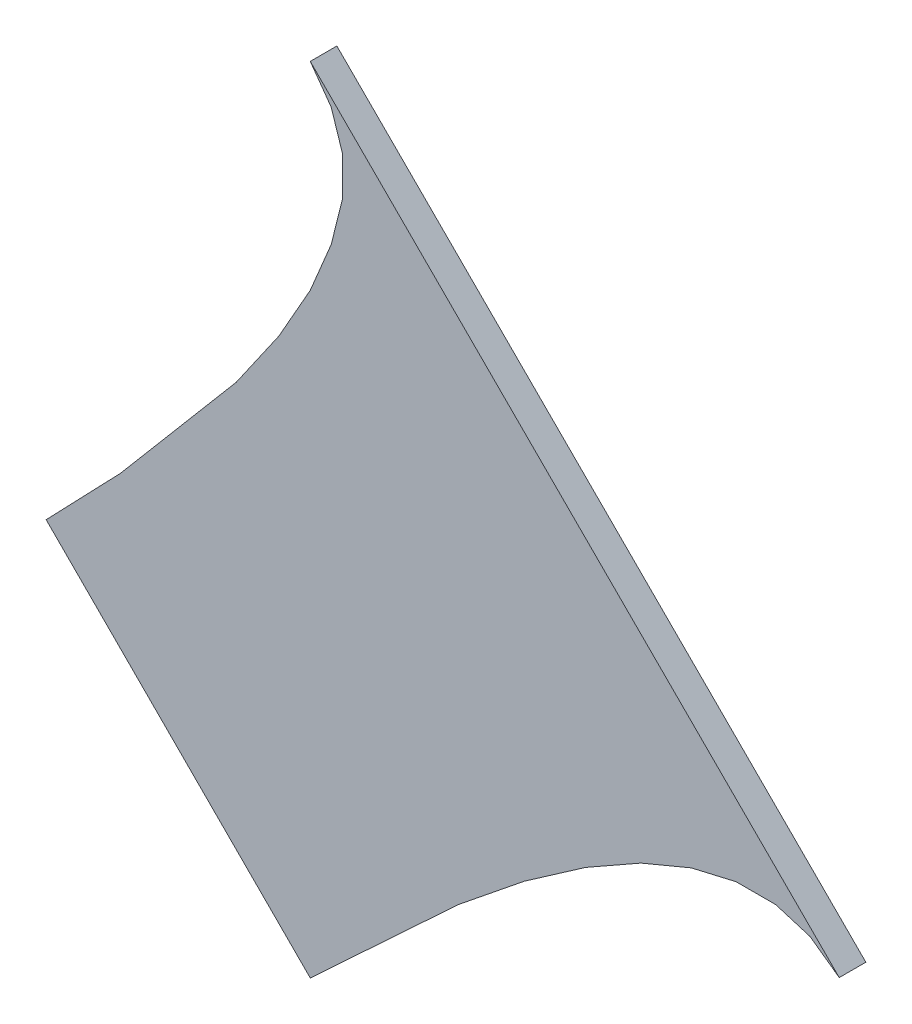
ISO-10303-21;
HEADER;
FILE_DESCRIPTION(('STEP AP214'),'2;1');
FILE_NAME('part.step','',(''),(''),'','','');
FILE_SCHEMA(('AUTOMOTIVE_DESIGN { 1 0 10303 214 1 1 1 1 }'));
ENDSEC;
DATA;
#1=APPLICATION_CONTEXT('core data for automotive mechanical design processes');
#2=APPLICATION_PROTOCOL_DEFINITION('international standard','automotive_design',2000,#1);
#3=PRODUCT_CONTEXT('',#1,'mechanical');
#4=PRODUCT('Part','Part','',(#3));
#5=PRODUCT_RELATED_PRODUCT_CATEGORY('part','',(#4));
#6=PRODUCT_DEFINITION_FORMATION('','',#4);
#7=PRODUCT_DEFINITION_CONTEXT('part definition',#1,'design');
#8=PRODUCT_DEFINITION('design','',#6,#7);
#9=PRODUCT_DEFINITION_SHAPE('','',#8);
#10=(LENGTH_UNIT() NAMED_UNIT(*) SI_UNIT(.MILLI.,.METRE.));
#11=(NAMED_UNIT(*) PLANE_ANGLE_UNIT() SI_UNIT($,.RADIAN.));
#12=(NAMED_UNIT(*) SI_UNIT($,.STERADIAN.) SOLID_ANGLE_UNIT());
#13=UNCERTAINTY_MEASURE_WITH_UNIT(LENGTH_MEASURE(1.E-05),#10,'distance_accuracy_value','');
#14=(GEOMETRIC_REPRESENTATION_CONTEXT(3) GLOBAL_UNCERTAINTY_ASSIGNED_CONTEXT((#13)) GLOBAL_UNIT_ASSIGNED_CONTEXT((#10,
#11,#12)) REPRESENTATION_CONTEXT('',''));
#15=CARTESIAN_POINT('',(0.,0.,0.));
#16=DIRECTION('',(0.,0.,1.));
#17=DIRECTION('',(1.,0.,0.));
#18=AXIS2_PLACEMENT_3D('',#15,#16,#17);
#19=CARTESIAN_POINT('',(108.472999572754,115.299003601074,0.));
#20=DIRECTION('',(-0.680734703798649,0.732530042417487,0.));
#21=DIRECTION('',(0.732530042417487,0.680734703798649,0.));
#22=AXIS2_PLACEMENT_3D('',#19,#20,#21);
#23=PLANE('',#22);
#24=DIRECTION('',(0.732530042417487,0.680734703798649,0.));
#25=VECTOR('',#24,1.);
#26=CARTESIAN_POINT('',(108.472999572754,115.299003601074,0.03556));
#27=LINE('',#26,#25);
#28=CARTESIAN_POINT('',(108.472999572754,115.299003601074,0.03556));
#29=VERTEX_POINT('',#28);
#30=CARTESIAN_POINT('',(108.670997619629,115.483001708984,0.03556));
#31=VERTEX_POINT('',#30);
#32=EDGE_CURVE('E11',#29,#31,#27,.T.);
#33=ORIENTED_EDGE('',*,*,#32,.F.);
#34=DIRECTION('',(0.,0.,1.));
#35=VECTOR('',#34,1.);
#36=CARTESIAN_POINT('',(108.472999572754,115.299003601074,0.));
#37=LINE('',#36,#35);
#38=CARTESIAN_POINT('',(108.472999572754,115.299003601074,0.));
#39=VERTEX_POINT('',#38);
#40=EDGE_CURVE('E24',#39,#29,#37,.T.);
#41=ORIENTED_EDGE('',*,*,#40,.F.);
#42=DIRECTION('',(0.732530042417487,0.680734703798649,0.));
#43=VECTOR('',#42,1.);
#44=CARTESIAN_POINT('',(108.472999572754,115.299003601074,0.));
#45=LINE('',#44,#43);
#46=CARTESIAN_POINT('',(108.670997619629,115.483001708984,0.));
#47=VERTEX_POINT('',#46);
#48=EDGE_CURVE('E172',#39,#47,#45,.T.);
#49=ORIENTED_EDGE('',*,*,#48,.T.);
#50=DIRECTION('',(0.,0.,1.));
#51=VECTOR('',#50,1.);
#52=CARTESIAN_POINT('',(108.670997619629,115.483001708984,0.));
#53=LINE('',#52,#51);
#54=EDGE_CURVE('E37',#47,#31,#53,.T.);
#55=ORIENTED_EDGE('',*,*,#54,.T.);
#56=EDGE_LOOP('',(#33,#41,#49,#55));
#57=FACE_BOUND('',#56,.T.);
#58=ADVANCED_FACE('F17',(#57),#23,.F.);
#59=CARTESIAN_POINT('',(108.670997619629,115.483001708984,0.));
#60=DIRECTION('',(-0.627898828977901,0.778294970154748,0.));
#61=DIRECTION('',(0.778294970154748,0.627898828977901,0.));
#62=AXIS2_PLACEMENT_3D('',#59,#60,#61);
#63=PLANE('',#62);
#64=DIRECTION('',(0.778294970154748,0.627898828977901,0.));
#65=VECTOR('',#64,1.);
#66=CARTESIAN_POINT('',(108.670997619629,115.483001708984,0.03556));
#67=LINE('',#66,#65);
#68=CARTESIAN_POINT('',(108.759002685547,115.554000854492,0.03556));
#69=VERTEX_POINT('',#68);
#70=EDGE_CURVE('E308',#31,#69,#67,.T.);
#71=ORIENTED_EDGE('',*,*,#70,.F.);
#72=ORIENTED_EDGE('',*,*,#54,.F.);
#73=DIRECTION('',(0.778294970154748,0.627898828977901,0.));
#74=VECTOR('',#73,1.);
#75=CARTESIAN_POINT('',(108.670997619629,115.483001708984,0.));
#76=LINE('',#75,#74);
#77=CARTESIAN_POINT('',(108.759002685547,115.554000854492,0.));
#78=VERTEX_POINT('',#77);
#79=EDGE_CURVE('E305',#47,#78,#76,.T.);
#80=ORIENTED_EDGE('',*,*,#79,.T.);
#81=DIRECTION('',(0.,0.,1.));
#82=VECTOR('',#81,1.);
#83=CARTESIAN_POINT('',(108.759002685547,115.554000854492,0.));
#84=LINE('',#83,#82);
#85=EDGE_CURVE('E303',#78,#69,#84,.T.);
#86=ORIENTED_EDGE('',*,*,#85,.T.);
#87=EDGE_LOOP('',(#71,#72,#80,#86));
#88=FACE_BOUND('',#87,.T.);
#89=ADVANCED_FACE('F316',(#88),#63,.F.);
#90=CARTESIAN_POINT('',(108.759002685547,115.554000854492,0.));
#91=DIRECTION('',(-0.570762267595056,0.821115359672287,0.));
#92=DIRECTION('',(0.821115359672287,0.570762267595056,0.));
#93=AXIS2_PLACEMENT_3D('',#90,#91,#92);
#94=PLANE('',#93);
#95=DIRECTION('',(0.821115359672287,0.570762267595056,0.));
#96=VECTOR('',#95,1.);
#97=CARTESIAN_POINT('',(108.759002685547,115.554000854492,0.03556));
#98=LINE('',#97,#96);
#99=CARTESIAN_POINT('',(108.841003417969,115.611000061035,0.03556));
#100=VERTEX_POINT('',#99);
#101=EDGE_CURVE('E300',#69,#100,#98,.T.);
#102=ORIENTED_EDGE('',*,*,#101,.F.);
#103=ORIENTED_EDGE('',*,*,#85,.F.);
#104=DIRECTION('',(0.821115359672287,0.570762267595056,0.));
#105=VECTOR('',#104,1.);
#106=CARTESIAN_POINT('',(108.759002685547,115.554000854492,0.));
#107=LINE('',#106,#105);
#108=CARTESIAN_POINT('',(108.841003417969,115.611000061035,0.));
#109=VERTEX_POINT('',#108);
#110=EDGE_CURVE('E297',#78,#109,#107,.T.);
#111=ORIENTED_EDGE('',*,*,#110,.T.);
#112=DIRECTION('',(0.,0.,1.));
#113=VECTOR('',#112,1.);
#114=CARTESIAN_POINT('',(108.841003417969,115.611000061035,0.));
#115=LINE('',#114,#113);
#116=EDGE_CURVE('E295',#109,#100,#115,.T.);
#117=ORIENTED_EDGE('',*,*,#116,.T.);
#118=EDGE_LOOP('',(#102,#103,#111,#117));
#119=FACE_BOUND('',#118,.T.);
#120=ADVANCED_FACE('F322',(#119),#94,.F.);
#121=CARTESIAN_POINT('',(108.841003417969,115.611000061035,0.));
#122=DIRECTION('',(-0.493616517242774,0.869679673158522,0.));
#123=DIRECTION('',(0.869679673158522,0.493616517242774,0.));
#124=AXIS2_PLACEMENT_3D('',#121,#122,#123);
#125=PLANE('',#124);
#126=DIRECTION('',(0.869679673158522,0.493616517242774,0.));
#127=VECTOR('',#126,1.);
#128=CARTESIAN_POINT('',(108.841003417969,115.611000061035,0.03556));
#129=LINE('',#128,#127);
#130=CARTESIAN_POINT('',(108.915000915527,115.65299987793,0.03556));
#131=VERTEX_POINT('',#130);
#132=EDGE_CURVE('E292',#100,#131,#129,.T.);
#133=ORIENTED_EDGE('',*,*,#132,.F.);
#134=ORIENTED_EDGE('',*,*,#116,.F.);
#135=DIRECTION('',(0.869679673158522,0.493616517242774,0.));
#136=VECTOR('',#135,1.);
#137=CARTESIAN_POINT('',(108.841003417969,115.611000061035,0.));
#138=LINE('',#137,#136);
#139=CARTESIAN_POINT('',(108.915000915527,115.65299987793,0.));
#140=VERTEX_POINT('',#139);
#141=EDGE_CURVE('E289',#109,#140,#138,.T.);
#142=ORIENTED_EDGE('',*,*,#141,.T.);
#143=DIRECTION('',(0.,0.,1.));
#144=VECTOR('',#143,1.);
#145=CARTESIAN_POINT('',(108.915000915527,115.65299987793,0.));
#146=LINE('',#145,#144);
#147=EDGE_CURVE('E287',#140,#131,#146,.T.);
#148=ORIENTED_EDGE('',*,*,#147,.T.);
#149=EDGE_LOOP('',(#133,#134,#142,#148));
#150=FACE_BOUND('',#149,.T.);
#151=ADVANCED_FACE('F324',(#150),#125,.F.);
#152=CARTESIAN_POINT('',(108.915000915527,115.65299987793,0.));
#153=DIRECTION('',(-0.385584994163033,0.922672321182495,0.));
#154=DIRECTION('',(0.922672321182495,0.385584994163033,0.));
#155=AXIS2_PLACEMENT_3D('',#152,#153,#154);
#156=PLANE('',#155);
#157=DIRECTION('',(0.922672321182495,0.385584994163033,0.));
#158=VECTOR('',#157,1.);
#159=CARTESIAN_POINT('',(108.915000915527,115.65299987793,0.03556));
#160=LINE('',#159,#158);
#161=CARTESIAN_POINT('',(108.982002258301,115.680999755859,0.03556));
#162=VERTEX_POINT('',#161);
#163=EDGE_CURVE('E284',#131,#162,#160,.T.);
#164=ORIENTED_EDGE('',*,*,#163,.F.);
#165=ORIENTED_EDGE('',*,*,#147,.F.);
#166=DIRECTION('',(0.922672321182495,0.385584994163033,0.));
#167=VECTOR('',#166,1.);
#168=CARTESIAN_POINT('',(108.915000915527,115.65299987793,0.));
#169=LINE('',#168,#167);
#170=CARTESIAN_POINT('',(108.982002258301,115.680999755859,0.));
#171=VERTEX_POINT('',#170);
#172=EDGE_CURVE('E281',#140,#171,#169,.T.);
#173=ORIENTED_EDGE('',*,*,#172,.T.);
#174=DIRECTION('',(0.,0.,1.));
#175=VECTOR('',#174,1.);
#176=CARTESIAN_POINT('',(108.982002258301,115.680999755859,0.));
#177=LINE('',#176,#175);
#178=EDGE_CURVE('E279',#171,#162,#177,.T.);
#179=ORIENTED_EDGE('',*,*,#178,.T.);
#180=EDGE_LOOP('',(#164,#165,#173,#179));
#181=FACE_BOUND('',#180,.T.);
#182=ADVANCED_FACE('F329',(#181),#156,.F.);
#183=CARTESIAN_POINT('',(108.982002258301,115.680999755859,0.));
#184=DIRECTION('',(-0.227237445006023,0.973839382848699,0.));
#185=DIRECTION('',(0.973839382848699,0.227237445006023,0.));
#186=AXIS2_PLACEMENT_3D('',#183,#184,#185);
#187=PLANE('',#186);
#188=DIRECTION('',(0.973839382848699,0.227237445006023,0.));
#189=VECTOR('',#188,1.);
#190=CARTESIAN_POINT('',(108.982002258301,115.680999755859,0.03556));
#191=LINE('',#190,#189);
#192=CARTESIAN_POINT('',(109.041999816895,115.694999694824,0.03556));
#193=VERTEX_POINT('',#192);
#194=EDGE_CURVE('E276',#162,#193,#191,.T.);
#195=ORIENTED_EDGE('',*,*,#194,.F.);
#196=ORIENTED_EDGE('',*,*,#178,.F.);
#197=DIRECTION('',(0.973839382848699,0.227237445006023,0.));
#198=VECTOR('',#197,1.);
#199=CARTESIAN_POINT('',(108.982002258301,115.680999755859,0.));
#200=LINE('',#199,#198);
#201=CARTESIAN_POINT('',(109.041999816895,115.694999694824,0.));
#202=VERTEX_POINT('',#201);
#203=EDGE_CURVE('E273',#171,#202,#200,.T.);
#204=ORIENTED_EDGE('',*,*,#203,.T.);
#205=DIRECTION('',(0.,0.,1.));
#206=VECTOR('',#205,1.);
#207=CARTESIAN_POINT('',(109.041999816895,115.694999694824,0.));
#208=LINE('',#207,#206);
#209=EDGE_CURVE('E271',#202,#193,#208,.T.);
#210=ORIENTED_EDGE('',*,*,#209,.T.);
#211=EDGE_LOOP('',(#195,#196,#204,#210));
#212=FACE_BOUND('',#211,.T.);
#213=ADVANCED_FACE('F332',(#212),#187,.F.);
#214=CARTESIAN_POINT('',(109.041999816895,115.694999694824,0.));
#215=DIRECTION('',(0.,1.,0.));
#216=DIRECTION('',(1.,0.,0.));
#217=AXIS2_PLACEMENT_3D('',#214,#215,#216);
#218=PLANE('',#217);
#219=DIRECTION('',(1.,0.,0.));
#220=VECTOR('',#219,1.);
#221=CARTESIAN_POINT('',(109.041999816895,115.694999694824,0.03556));
#222=LINE('',#221,#220);
#223=CARTESIAN_POINT('',(109.095001220703,115.694999694824,0.03556));
#224=VERTEX_POINT('',#223);
#225=EDGE_CURVE('E268',#193,#224,#222,.T.);
#226=ORIENTED_EDGE('',*,*,#225,.F.);
#227=ORIENTED_EDGE('',*,*,#209,.F.);
#228=DIRECTION('',(1.,0.,0.));
#229=VECTOR('',#228,1.);
#230=CARTESIAN_POINT('',(109.041999816895,115.694999694824,0.));
#231=LINE('',#230,#229);
#232=CARTESIAN_POINT('',(109.095001220703,115.694999694824,0.));
#233=VERTEX_POINT('',#232);
#234=EDGE_CURVE('E265',#202,#233,#231,.T.);
#235=ORIENTED_EDGE('',*,*,#234,.T.);
#236=DIRECTION('',(0.,0.,1.));
#237=VECTOR('',#236,1.);
#238=CARTESIAN_POINT('',(109.095001220703,115.694999694824,0.));
#239=LINE('',#238,#237);
#240=EDGE_CURVE('E263',#233,#224,#239,.T.);
#241=ORIENTED_EDGE('',*,*,#240,.T.);
#242=EDGE_LOOP('',(#226,#227,#235,#241));
#243=FACE_BOUND('',#242,.T.);
#244=ADVANCED_FACE('F337',(#243),#218,.F.);
#245=CARTESIAN_POINT('',(109.095001220703,115.694999694824,0.));
#246=DIRECTION('',(0.291174244115219,0.956670036932239,0.));
#247=DIRECTION('',(0.956670036932239,-0.291174244115219,0.));
#248=AXIS2_PLACEMENT_3D('',#245,#246,#247);
#249=PLANE('',#248);
#250=DIRECTION('',(0.956670036932239,-0.291174244115219,0.));
#251=VECTOR('',#250,1.);
#252=CARTESIAN_POINT('',(109.095001220703,115.694999694824,0.03556));
#253=LINE('',#252,#251);
#254=CARTESIAN_POINT('',(109.140998840332,115.680999755859,0.03556));
#255=VERTEX_POINT('',#254);
#256=EDGE_CURVE('E260',#224,#255,#253,.T.);
#257=ORIENTED_EDGE('',*,*,#256,.F.);
#258=ORIENTED_EDGE('',*,*,#240,.F.);
#259=DIRECTION('',(0.956670036932239,-0.291174244115219,0.));
#260=VECTOR('',#259,1.);
#261=CARTESIAN_POINT('',(109.095001220703,115.694999694824,0.));
#262=LINE('',#261,#260);
#263=CARTESIAN_POINT('',(109.140998840332,115.680999755859,0.));
#264=VERTEX_POINT('',#263);
#265=EDGE_CURVE('E257',#233,#264,#262,.T.);
#266=ORIENTED_EDGE('',*,*,#265,.T.);
#267=DIRECTION('',(0.,0.,1.));
#268=VECTOR('',#267,1.);
#269=CARTESIAN_POINT('',(109.140998840332,115.680999755859,0.));
#270=LINE('',#269,#268);
#271=EDGE_CURVE('E255',#264,#255,#270,.T.);
#272=ORIENTED_EDGE('',*,*,#271,.T.);
#273=EDGE_LOOP('',(#257,#258,#266,#272));
#274=FACE_BOUND('',#273,.T.);
#275=ADVANCED_FACE('F340',(#274),#249,.F.);
#276=CARTESIAN_POINT('',(109.140998840332,115.680999755859,0.));
#277=DIRECTION('',(0.583190650931696,0.812335315412216,0.));
#278=DIRECTION('',(0.812335315412216,-0.583190650931696,0.));
#279=AXIS2_PLACEMENT_3D('',#276,#277,#278);
#280=PLANE('',#279);
#281=DIRECTION('',(0.812335315412216,-0.583190650931696,0.));
#282=VECTOR('',#281,1.);
#283=CARTESIAN_POINT('',(109.140998840332,115.680999755859,0.03556));
#284=LINE('',#283,#282);
#285=CARTESIAN_POINT('',(109.180000305176,115.65299987793,0.03556));
#286=VERTEX_POINT('',#285);
#287=EDGE_CURVE('E252',#255,#286,#284,.T.);
#288=ORIENTED_EDGE('',*,*,#287,.F.);
#289=ORIENTED_EDGE('',*,*,#271,.F.);
#290=DIRECTION('',(0.812335315412216,-0.583190650931696,0.));
#291=VECTOR('',#290,1.);
#292=CARTESIAN_POINT('',(109.140998840332,115.680999755859,0.));
#293=LINE('',#292,#291);
#294=CARTESIAN_POINT('',(109.180000305176,115.65299987793,0.));
#295=VERTEX_POINT('',#294);
#296=EDGE_CURVE('E249',#264,#295,#293,.T.);
#297=ORIENTED_EDGE('',*,*,#296,.T.);
#298=DIRECTION('',(0.,0.,1.));
#299=VECTOR('',#298,1.);
#300=CARTESIAN_POINT('',(109.180000305176,115.65299987793,0.));
#301=LINE('',#300,#299);
#302=EDGE_CURVE('E247',#295,#286,#301,.T.);
#303=ORIENTED_EDGE('',*,*,#302,.T.);
#304=EDGE_LOOP('',(#288,#289,#297,#303));
#305=FACE_BOUND('',#304,.T.);
#306=ADVANCED_FACE('F345',(#305),#280,.F.);
#307=CARTESIAN_POINT('',(109.180000305176,115.65299987793,0.));
#308=DIRECTION('',(-0.707106781186548,-0.707106781186548,0.));
#309=DIRECTION('',(-0.707106781186548,0.707106781186548,0.));
#310=AXIS2_PLACEMENT_3D('',#307,#308,#309);
#311=PLANE('',#310);
#312=DIRECTION('',(-0.707106781186548,0.707106781186548,0.));
#313=VECTOR('',#312,1.);
#314=CARTESIAN_POINT('',(109.180000305176,115.65299987793,0.03556));
#315=LINE('',#314,#313);
#316=CARTESIAN_POINT('',(108.472999572754,116.360000610352,0.03556));
#317=VERTEX_POINT('',#316);
#318=EDGE_CURVE('E244',#286,#317,#315,.T.);
#319=ORIENTED_EDGE('',*,*,#318,.F.);
#320=ORIENTED_EDGE('',*,*,#302,.F.);
#321=DIRECTION('',(-0.707106781186548,0.707106781186548,0.));
#322=VECTOR('',#321,1.);
#323=CARTESIAN_POINT('',(109.180000305176,115.65299987793,0.));
#324=LINE('',#323,#322);
#325=CARTESIAN_POINT('',(108.472999572754,116.360000610352,0.));
#326=VERTEX_POINT('',#325);
#327=EDGE_CURVE('E241',#295,#326,#324,.T.);
#328=ORIENTED_EDGE('',*,*,#327,.T.);
#329=DIRECTION('',(0.,0.,1.));
#330=VECTOR('',#329,1.);
#331=CARTESIAN_POINT('',(108.472999572754,116.360000610352,0.));
#332=LINE('',#331,#330);
#333=EDGE_CURVE('E239',#326,#317,#332,.T.);
#334=ORIENTED_EDGE('',*,*,#333,.T.);
#335=EDGE_LOOP('',(#319,#320,#328,#334));
#336=FACE_BOUND('',#335,.T.);
#337=ADVANCED_FACE('F348',(#336),#311,.F.);
#338=CARTESIAN_POINT('',(108.472999572754,116.360000610352,0.));
#339=DIRECTION('',(0.812335315412216,0.583190650931696,0.));
#340=DIRECTION('',(0.583190650931696,-0.812335315412216,0.));
#341=AXIS2_PLACEMENT_3D('',#338,#339,#340);
#342=PLANE('',#341);
#343=DIRECTION('',(0.583190650931696,-0.812335315412216,0.));
#344=VECTOR('',#343,1.);
#345=CARTESIAN_POINT('',(108.472999572754,116.360000610352,0.03556));
#346=LINE('',#345,#344);
#347=CARTESIAN_POINT('',(108.500999450684,116.320999145508,0.03556));
#348=VERTEX_POINT('',#347);
#349=EDGE_CURVE('E236',#317,#348,#346,.T.);
#350=ORIENTED_EDGE('',*,*,#349,.F.);
#351=ORIENTED_EDGE('',*,*,#333,.F.);
#352=DIRECTION('',(0.583190650931696,-0.812335315412216,0.));
#353=VECTOR('',#352,1.);
#354=CARTESIAN_POINT('',(108.472999572754,116.360000610352,0.));
#355=LINE('',#354,#353);
#356=CARTESIAN_POINT('',(108.500999450684,116.320999145508,0.));
#357=VERTEX_POINT('',#356);
#358=EDGE_CURVE('E233',#326,#357,#355,.T.);
#359=ORIENTED_EDGE('',*,*,#358,.T.);
#360=DIRECTION('',(0.,0.,1.));
#361=VECTOR('',#360,1.);
#362=CARTESIAN_POINT('',(108.500999450684,116.320999145508,0.));
#363=LINE('',#362,#361);
#364=EDGE_CURVE('E231',#357,#348,#363,.T.);
#365=ORIENTED_EDGE('',*,*,#364,.T.);
#366=EDGE_LOOP('',(#350,#351,#359,#365));
#367=FACE_BOUND('',#366,.T.);
#368=ADVANCED_FACE('F353',(#367),#342,.F.);
#369=CARTESIAN_POINT('',(108.500999450684,116.320999145508,0.));
#370=DIRECTION('',(0.950728829058079,0.310023698445544,0.));
#371=DIRECTION('',(0.310023698445544,-0.950728829058079,0.));
#372=AXIS2_PLACEMENT_3D('',#369,#370,#371);
#373=PLANE('',#372);
#374=DIRECTION('',(0.310023698445544,-0.950728829058079,0.));
#375=VECTOR('',#374,1.);
#376=CARTESIAN_POINT('',(108.500999450684,116.320999145508,0.03556));
#377=LINE('',#376,#375);
#378=CARTESIAN_POINT('',(108.515998840332,116.275001525879,0.03556));
#379=VERTEX_POINT('',#378);
#380=EDGE_CURVE('E228',#348,#379,#377,.T.);
#381=ORIENTED_EDGE('',*,*,#380,.F.);
#382=ORIENTED_EDGE('',*,*,#364,.F.);
#383=DIRECTION('',(0.310023698445544,-0.950728829058079,0.));
#384=VECTOR('',#383,1.);
#385=CARTESIAN_POINT('',(108.500999450684,116.320999145508,0.));
#386=LINE('',#385,#384);
#387=CARTESIAN_POINT('',(108.515998840332,116.275001525879,0.));
#388=VERTEX_POINT('',#387);
#389=EDGE_CURVE('E225',#357,#388,#386,.T.);
#390=ORIENTED_EDGE('',*,*,#389,.T.);
#391=DIRECTION('',(0.,0.,1.));
#392=VECTOR('',#391,1.);
#393=CARTESIAN_POINT('',(108.515998840332,116.275001525879,0.));
#394=LINE('',#393,#392);
#395=EDGE_CURVE('E223',#388,#379,#394,.T.);
#396=ORIENTED_EDGE('',*,*,#395,.T.);
#397=EDGE_LOOP('',(#381,#382,#390,#396));
#398=FACE_BOUND('',#397,.T.);
#399=ADVANCED_FACE('F356',(#398),#373,.F.);
#400=CARTESIAN_POINT('',(108.515998840332,116.275001525879,0.));
#401=DIRECTION('',(1.,0.,0.));
#402=DIRECTION('',(0.,-1.,0.));
#403=AXIS2_PLACEMENT_3D('',#400,#401,#402);
#404=PLANE('',#403);
#405=DIRECTION('',(0.,-1.,0.));
#406=VECTOR('',#405,1.);
#407=CARTESIAN_POINT('',(108.515998840332,116.275001525879,0.03556));
#408=LINE('',#407,#406);
#409=CARTESIAN_POINT('',(108.515998840332,116.22200012207,0.03556));
#410=VERTEX_POINT('',#409);
#411=EDGE_CURVE('E220',#379,#410,#408,.T.);
#412=ORIENTED_EDGE('',*,*,#411,.F.);
#413=ORIENTED_EDGE('',*,*,#395,.F.);
#414=DIRECTION('',(0.,-1.,0.));
#415=VECTOR('',#414,1.);
#416=CARTESIAN_POINT('',(108.515998840332,116.275001525879,0.));
#417=LINE('',#416,#415);
#418=CARTESIAN_POINT('',(108.515998840332,116.22200012207,0.));
#419=VERTEX_POINT('',#418);
#420=EDGE_CURVE('E217',#388,#419,#417,.T.);
#421=ORIENTED_EDGE('',*,*,#420,.T.);
#422=DIRECTION('',(0.,0.,1.));
#423=VECTOR('',#422,1.);
#424=CARTESIAN_POINT('',(108.515998840332,116.22200012207,0.));
#425=LINE('',#424,#423);
#426=EDGE_CURVE('E215',#419,#410,#425,.T.);
#427=ORIENTED_EDGE('',*,*,#426,.T.);
#428=EDGE_LOOP('',(#412,#413,#421,#427));
#429=FACE_BOUND('',#428,.T.);
#430=ADVANCED_FACE('F361',(#429),#404,.F.);
#431=CARTESIAN_POINT('',(108.515998840332,116.22200012207,0.));
#432=DIRECTION('',(0.970142500145332,-0.242535625036333,0.));
#433=DIRECTION('',(-0.242535625036333,-0.970142500145332,0.));
#434=AXIS2_PLACEMENT_3D('',#431,#432,#433);
#435=PLANE('',#434);
#436=DIRECTION('',(-0.242535625036333,-0.970142500145332,0.));
#437=VECTOR('',#436,1.);
#438=CARTESIAN_POINT('',(108.515998840332,116.22200012207,0.03556));
#439=LINE('',#438,#437);
#440=CARTESIAN_POINT('',(108.500999450684,116.162002563477,0.03556));
#441=VERTEX_POINT('',#440);
#442=EDGE_CURVE('E212',#410,#441,#439,.T.);
#443=ORIENTED_EDGE('',*,*,#442,.F.);
#444=ORIENTED_EDGE('',*,*,#426,.F.);
#445=DIRECTION('',(-0.242535625036333,-0.970142500145332,0.));
#446=VECTOR('',#445,1.);
#447=CARTESIAN_POINT('',(108.515998840332,116.22200012207,0.));
#448=LINE('',#447,#446);
#449=CARTESIAN_POINT('',(108.500999450684,116.162002563477,0.));
#450=VERTEX_POINT('',#449);
#451=EDGE_CURVE('E209',#419,#450,#448,.T.);
#452=ORIENTED_EDGE('',*,*,#451,.T.);
#453=DIRECTION('',(0.,0.,1.));
#454=VECTOR('',#453,1.);
#455=CARTESIAN_POINT('',(108.500999450684,116.162002563477,0.));
#456=LINE('',#455,#454);
#457=EDGE_CURVE('E207',#450,#441,#456,.T.);
#458=ORIENTED_EDGE('',*,*,#457,.T.);
#459=EDGE_LOOP('',(#443,#444,#452,#458));
#460=FACE_BOUND('',#459,.T.);
#461=ADVANCED_FACE('F364',(#460),#435,.F.);
#462=CARTESIAN_POINT('',(108.500999450684,116.162002563477,0.));
#463=DIRECTION('',(0.922672321182495,-0.385584994163033,0.));
#464=DIRECTION('',(-0.385584994163033,-0.922672321182495,0.));
#465=AXIS2_PLACEMENT_3D('',#462,#463,#464);
#466=PLANE('',#465);
#467=DIRECTION('',(-0.385584994163033,-0.922672321182495,0.));
#468=VECTOR('',#467,1.);
#469=CARTESIAN_POINT('',(108.500999450684,116.162002563477,0.03556));
#470=LINE('',#469,#468);
#471=CARTESIAN_POINT('',(108.472999572754,116.095001220703,0.03556));
#472=VERTEX_POINT('',#471);
#473=EDGE_CURVE('E204',#441,#472,#470,.T.);
#474=ORIENTED_EDGE('',*,*,#473,.F.);
#475=ORIENTED_EDGE('',*,*,#457,.F.);
#476=DIRECTION('',(-0.385584994163033,-0.922672321182495,0.));
#477=VECTOR('',#476,1.);
#478=CARTESIAN_POINT('',(108.500999450684,116.162002563477,0.));
#479=LINE('',#478,#477);
#480=CARTESIAN_POINT('',(108.472999572754,116.095001220703,0.));
#481=VERTEX_POINT('',#480);
#482=EDGE_CURVE('E201',#450,#481,#479,.T.);
#483=ORIENTED_EDGE('',*,*,#482,.T.);
#484=DIRECTION('',(0.,0.,1.));
#485=VECTOR('',#484,1.);
#486=CARTESIAN_POINT('',(108.472999572754,116.095001220703,0.));
#487=LINE('',#486,#485);
#488=EDGE_CURVE('E199',#481,#472,#487,.T.);
#489=ORIENTED_EDGE('',*,*,#488,.T.);
#490=EDGE_LOOP('',(#474,#475,#483,#489));
#491=FACE_BOUND('',#490,.T.);
#492=ADVANCED_FACE('F369',(#491),#466,.F.);
#493=CARTESIAN_POINT('',(108.472999572754,116.095001220703,0.));
#494=DIRECTION('',(0.869679673158522,-0.493616517242774,0.));
#495=DIRECTION('',(-0.493616517242774,-0.869679673158522,0.));
#496=AXIS2_PLACEMENT_3D('',#493,#494,#495);
#497=PLANE('',#496);
#498=DIRECTION('',(-0.493616517242774,-0.869679673158522,0.));
#499=VECTOR('',#498,1.);
#500=CARTESIAN_POINT('',(108.472999572754,116.095001220703,0.03556));
#501=LINE('',#500,#499);
#502=CARTESIAN_POINT('',(108.430999755859,116.021003723145,0.03556));
#503=VERTEX_POINT('',#502);
#504=EDGE_CURVE('E196',#472,#503,#501,.T.);
#505=ORIENTED_EDGE('',*,*,#504,.F.);
#506=ORIENTED_EDGE('',*,*,#488,.F.);
#507=DIRECTION('',(-0.493616517242774,-0.869679673158522,0.));
#508=VECTOR('',#507,1.);
#509=CARTESIAN_POINT('',(108.472999572754,116.095001220703,0.));
#510=LINE('',#509,#508);
#511=CARTESIAN_POINT('',(108.430999755859,116.021003723145,0.));
#512=VERTEX_POINT('',#511);
#513=EDGE_CURVE('E193',#481,#512,#510,.T.);
#514=ORIENTED_EDGE('',*,*,#513,.T.);
#515=DIRECTION('',(0.,0.,1.));
#516=VECTOR('',#515,1.);
#517=CARTESIAN_POINT('',(108.430999755859,116.021003723145,0.));
#518=LINE('',#517,#516);
#519=EDGE_CURVE('E191',#512,#503,#518,.T.);
#520=ORIENTED_EDGE('',*,*,#519,.T.);
#521=EDGE_LOOP('',(#505,#506,#514,#520));
#522=FACE_BOUND('',#521,.T.);
#523=ADVANCED_FACE('F372',(#522),#497,.F.);
#524=CARTESIAN_POINT('',(108.430999755859,116.021003723145,0.));
#525=DIRECTION('',(0.821115359672287,-0.570762267595056,0.));
#526=DIRECTION('',(-0.570762267595056,-0.821115359672287,0.));
#527=AXIS2_PLACEMENT_3D('',#524,#525,#526);
#528=PLANE('',#527);
#529=DIRECTION('',(-0.570762267595056,-0.821115359672287,0.));
#530=VECTOR('',#529,1.);
#531=CARTESIAN_POINT('',(108.430999755859,116.021003723145,0.03556));
#532=LINE('',#531,#530);
#533=CARTESIAN_POINT('',(108.374000549316,115.939002990723,0.03556));
#534=VERTEX_POINT('',#533);
#535=EDGE_CURVE('E188',#503,#534,#532,.T.);
#536=ORIENTED_EDGE('',*,*,#535,.F.);
#537=ORIENTED_EDGE('',*,*,#519,.F.);
#538=DIRECTION('',(-0.570762267595056,-0.821115359672287,0.));
#539=VECTOR('',#538,1.);
#540=CARTESIAN_POINT('',(108.430999755859,116.021003723145,0.));
#541=LINE('',#540,#539);
#542=CARTESIAN_POINT('',(108.374000549316,115.939002990723,0.));
#543=VERTEX_POINT('',#542);
#544=EDGE_CURVE('E185',#512,#543,#541,.T.);
#545=ORIENTED_EDGE('',*,*,#544,.T.);
#546=DIRECTION('',(0.,0.,1.));
#547=VECTOR('',#546,1.);
#548=CARTESIAN_POINT('',(108.374000549316,115.939002990723,0.));
#549=LINE('',#548,#547);
#550=EDGE_CURVE('E183',#543,#534,#549,.T.);
#551=ORIENTED_EDGE('',*,*,#550,.T.);
#552=EDGE_LOOP('',(#536,#537,#545,#551));
#553=FACE_BOUND('',#552,.T.);
#554=ADVANCED_FACE('F377',(#553),#528,.F.);
#555=CARTESIAN_POINT('',(108.374000549316,115.939002990723,0.));
#556=DIRECTION('',(0.7630833257464,-0.646300114473001,0.));
#557=DIRECTION('',(-0.646300114473001,-0.7630833257464,0.));
#558=AXIS2_PLACEMENT_3D('',#555,#556,#557);
#559=PLANE('',#558);
#560=DIRECTION('',(-0.646300114473001,-0.7630833257464,0.));
#561=VECTOR('',#560,1.);
#562=CARTESIAN_POINT('',(108.374000549316,115.939002990723,0.03556));
#563=LINE('',#562,#561);
#564=CARTESIAN_POINT('',(108.21900177002,115.755996704102,0.03556));
#565=VERTEX_POINT('',#564);
#566=EDGE_CURVE('E180',#534,#565,#563,.T.);
#567=ORIENTED_EDGE('',*,*,#566,.F.);
#568=ORIENTED_EDGE('',*,*,#550,.F.);
#569=DIRECTION('',(-0.646300114473001,-0.7630833257464,0.));
#570=VECTOR('',#569,1.);
#571=CARTESIAN_POINT('',(108.374000549316,115.939002990723,0.));
#572=LINE('',#571,#570);
#573=CARTESIAN_POINT('',(108.21900177002,115.755996704102,0.));
#574=VERTEX_POINT('',#573);
#575=EDGE_CURVE('E178',#543,#574,#572,.T.);
#576=ORIENTED_EDGE('',*,*,#575,.T.);
#577=DIRECTION('',(0.,0.,1.));
#578=VECTOR('',#577,1.);
#579=CARTESIAN_POINT('',(108.21900177002,115.755996704102,0.));
#580=LINE('',#579,#578);
#581=EDGE_CURVE('E163',#574,#565,#580,.T.);
#582=ORIENTED_EDGE('',*,*,#581,.T.);
#583=EDGE_LOOP('',(#567,#568,#576,#582));
#584=FACE_BOUND('',#583,.T.);
#585=ADVANCED_FACE('F379',(#584),#559,.F.);
#586=CARTESIAN_POINT('',(108.21900177002,115.755996704102,0.));
#587=DIRECTION('',(0.720960303981228,-0.692976363293364,0.));
#588=DIRECTION('',(-0.692976363293364,-0.720960303981228,0.));
#589=AXIS2_PLACEMENT_3D('',#586,#587,#588);
#590=PLANE('',#589);
#591=DIRECTION('',(-0.692976363293363,-0.720960303981228,0.));
#592=VECTOR('',#591,1.);
#593=CARTESIAN_POINT('',(108.21900177002,115.755996704102,0.03556));
#594=LINE('',#593,#592);
#595=CARTESIAN_POINT('',(108.120002746582,115.65299987793,0.03556));
#596=VERTEX_POINT('',#595);
#597=EDGE_CURVE('E167',#565,#596,#594,.T.);
#598=ORIENTED_EDGE('',*,*,#597,.F.);
#599=ORIENTED_EDGE('',*,*,#581,.F.);
#600=DIRECTION('',(-0.692976363293363,-0.720960303981228,0.));
#601=VECTOR('',#600,1.);
#602=CARTESIAN_POINT('',(108.21900177002,115.755996704102,0.));
#603=LINE('',#602,#601);
#604=CARTESIAN_POINT('',(108.120002746582,115.65299987793,0.));
#605=VERTEX_POINT('',#604);
#606=EDGE_CURVE('E159',#574,#605,#603,.T.);
#607=ORIENTED_EDGE('',*,*,#606,.T.);
#608=DIRECTION('',(0.,0.,1.));
#609=VECTOR('',#608,1.);
#610=CARTESIAN_POINT('',(108.120002746582,115.65299987793,0.));
#611=LINE('',#610,#609);
#612=EDGE_CURVE('E149',#605,#596,#611,.T.);
#613=ORIENTED_EDGE('',*,*,#612,.T.);
#614=EDGE_LOOP('',(#598,#599,#607,#613));
#615=FACE_BOUND('',#614,.T.);
#616=ADVANCED_FACE('F162',(#615),#590,.F.);
#617=CARTESIAN_POINT('',(108.120002746582,115.65299987793,0.));
#618=DIRECTION('',(0.708105685017781,0.706106464242822,0.));
#619=DIRECTION('',(0.706106464242822,-0.708105685017781,0.));
#620=AXIS2_PLACEMENT_3D('',#617,#618,#619);
#621=PLANE('',#620);
#622=DIRECTION('',(0.706106464242822,-0.708105685017781,0.));
#623=VECTOR('',#622,1.);
#624=CARTESIAN_POINT('',(108.120002746582,115.65299987793,0.03556));
#625=LINE('',#624,#623);
#626=EDGE_CURVE('E155',#596,#29,#625,.T.);
#627=ORIENTED_EDGE('',*,*,#626,.F.);
#628=ORIENTED_EDGE('',*,*,#612,.F.);
#629=DIRECTION('',(0.706106464242822,-0.708105685017781,0.));
#630=VECTOR('',#629,1.);
#631=CARTESIAN_POINT('',(108.120002746582,115.65299987793,0.));
#632=LINE('',#631,#630);
#633=EDGE_CURVE('E153',#605,#39,#632,.T.);
#634=ORIENTED_EDGE('',*,*,#633,.T.);
#635=ORIENTED_EDGE('',*,*,#40,.T.);
#636=EDGE_LOOP('',(#627,#628,#634,#635));
#637=FACE_BOUND('',#636,.T.);
#638=ADVANCED_FACE('F151',(#637),#621,.F.);
#639=CARTESIAN_POINT('',(108.472999572754,115.299003601074,0.));
#640=DIRECTION('',(0.,0.,1.));
#641=DIRECTION('',(1.,0.,0.));
#642=AXIS2_PLACEMENT_3D('',#639,#640,#641);
#643=PLANE('',#642);
#644=ORIENTED_EDGE('',*,*,#633,.F.);
#645=ORIENTED_EDGE('',*,*,#606,.F.);
#646=ORIENTED_EDGE('',*,*,#575,.F.);
#647=ORIENTED_EDGE('',*,*,#544,.F.);
#648=ORIENTED_EDGE('',*,*,#513,.F.);
#649=ORIENTED_EDGE('',*,*,#482,.F.);
#650=ORIENTED_EDGE('',*,*,#451,.F.);
#651=ORIENTED_EDGE('',*,*,#420,.F.);
#652=ORIENTED_EDGE('',*,*,#389,.F.);
#653=ORIENTED_EDGE('',*,*,#358,.F.);
#654=ORIENTED_EDGE('',*,*,#327,.F.);
#655=ORIENTED_EDGE('',*,*,#296,.F.);
#656=ORIENTED_EDGE('',*,*,#265,.F.);
#657=ORIENTED_EDGE('',*,*,#234,.F.);
#658=ORIENTED_EDGE('',*,*,#203,.F.);
#659=ORIENTED_EDGE('',*,*,#172,.F.);
#660=ORIENTED_EDGE('',*,*,#141,.F.);
#661=ORIENTED_EDGE('',*,*,#110,.F.);
#662=ORIENTED_EDGE('',*,*,#79,.F.);
#663=ORIENTED_EDGE('',*,*,#48,.F.);
#664=EDGE_LOOP('',(#644,#645,#646,#647,#648,#649,#650,#651,#652,#653,#654,#655,#656,#657,#658,
#659,#660,#661,#662,#663));
#665=FACE_BOUND('',#664,.T.);
#666=ADVANCED_FACE('F170',(#665),#643,.F.);
#667=CARTESIAN_POINT('',(108.472999572754,115.299003601074,0.03556));
#668=DIRECTION('',(0.,0.,1.));
#669=DIRECTION('',(1.,0.,0.));
#670=AXIS2_PLACEMENT_3D('',#667,#668,#669);
#671=PLANE('',#670);
#672=ORIENTED_EDGE('',*,*,#32,.T.);
#673=ORIENTED_EDGE('',*,*,#70,.T.);
#674=ORIENTED_EDGE('',*,*,#101,.T.);
#675=ORIENTED_EDGE('',*,*,#132,.T.);
#676=ORIENTED_EDGE('',*,*,#163,.T.);
#677=ORIENTED_EDGE('',*,*,#194,.T.);
#678=ORIENTED_EDGE('',*,*,#225,.T.);
#679=ORIENTED_EDGE('',*,*,#256,.T.);
#680=ORIENTED_EDGE('',*,*,#287,.T.);
#681=ORIENTED_EDGE('',*,*,#318,.T.);
#682=ORIENTED_EDGE('',*,*,#349,.T.);
#683=ORIENTED_EDGE('',*,*,#380,.T.);
#684=ORIENTED_EDGE('',*,*,#411,.T.);
#685=ORIENTED_EDGE('',*,*,#442,.T.);
#686=ORIENTED_EDGE('',*,*,#473,.T.);
#687=ORIENTED_EDGE('',*,*,#504,.T.);
#688=ORIENTED_EDGE('',*,*,#535,.T.);
#689=ORIENTED_EDGE('',*,*,#566,.T.);
#690=ORIENTED_EDGE('',*,*,#597,.T.);
#691=ORIENTED_EDGE('',*,*,#626,.T.);
#692=EDGE_LOOP('',(#672,#673,#674,#675,#676,#677,#678,#679,#680,#681,#682,#683,#684,#685,#686,
#687,#688,#689,#690,#691));
#693=FACE_BOUND('',#692,.T.);
#694=ADVANCED_FACE('F319',(#693),#671,.T.);
#695=CLOSED_SHELL('',(#58,#89,#120,#151,#182,#213,#244,#275,#306,#337,#368,#399,#430,#461,#492,
#523,#554,#585,#616,#638,#666,#694));
#696=MANIFOLD_SOLID_BREP('B1',#695);
#697=ADVANCED_BREP_SHAPE_REPRESENTATION('',(#18,#696),#14);
#698=SHAPE_DEFINITION_REPRESENTATION(#9,#697);
ENDSEC;
END-ISO-10303-21;
